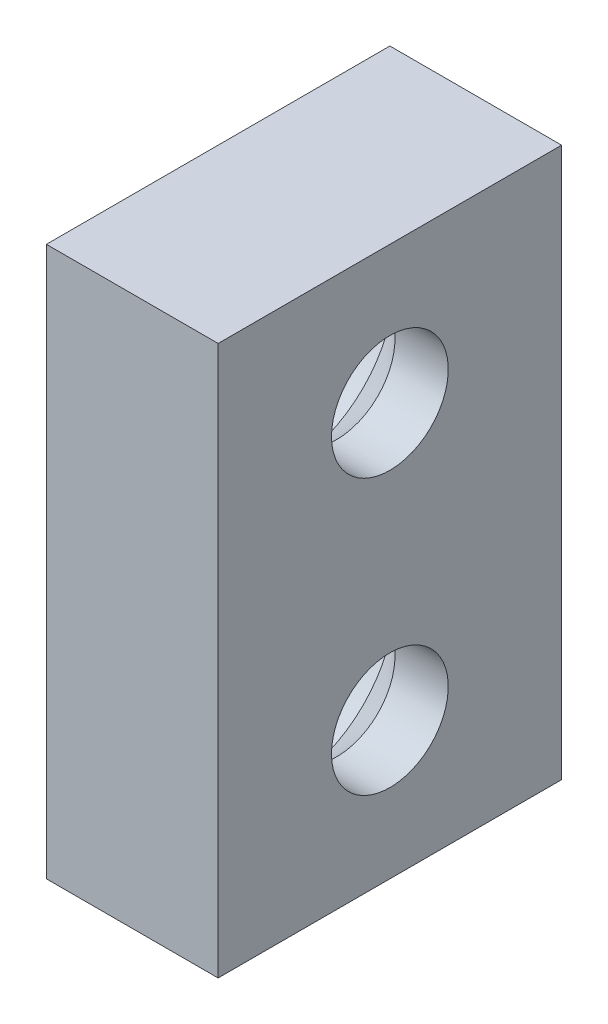
ISO-10303-21;
HEADER;
FILE_DESCRIPTION(('STEP AP214'),'2;1');
FILE_NAME('part.step','',(''),(''),'','','');
FILE_SCHEMA(('AUTOMOTIVE_DESIGN { 1 0 10303 214 1 1 1 1 }'));
ENDSEC;
DATA;
#1=APPLICATION_CONTEXT('core data for automotive mechanical design processes');
#2=APPLICATION_PROTOCOL_DEFINITION('international standard','automotive_design',2000,#1);
#3=PRODUCT_CONTEXT('',#1,'mechanical');
#4=PRODUCT('Part','Part','',(#3));
#5=PRODUCT_RELATED_PRODUCT_CATEGORY('part','',(#4));
#6=PRODUCT_DEFINITION_FORMATION('','',#4);
#7=PRODUCT_DEFINITION_CONTEXT('part definition',#1,'design');
#8=PRODUCT_DEFINITION('design','',#6,#7);
#9=PRODUCT_DEFINITION_SHAPE('','',#8);
#10=(LENGTH_UNIT() NAMED_UNIT(*) SI_UNIT(.MILLI.,.METRE.));
#11=(NAMED_UNIT(*) PLANE_ANGLE_UNIT() SI_UNIT($,.RADIAN.));
#12=(NAMED_UNIT(*) SI_UNIT($,.STERADIAN.) SOLID_ANGLE_UNIT());
#13=UNCERTAINTY_MEASURE_WITH_UNIT(LENGTH_MEASURE(1.E-05),#10,'distance_accuracy_value','');
#14=(GEOMETRIC_REPRESENTATION_CONTEXT(3) GLOBAL_UNCERTAINTY_ASSIGNED_CONTEXT((#13)) GLOBAL_UNIT_ASSIGNED_CONTEXT((#10,
#11,#12)) REPRESENTATION_CONTEXT('',''));
#15=CARTESIAN_POINT('',(0.,0.,0.));
#16=DIRECTION('',(0.,0.,1.));
#17=DIRECTION('',(1.,0.,0.));
#18=AXIS2_PLACEMENT_3D('',#15,#16,#17);
#19=CARTESIAN_POINT('',(2.0023,4.,5.));
#20=DIRECTION('',(-1.,0.,0.));
#21=DIRECTION('',(0.,0.,1.));
#22=AXIS2_PLACEMENT_3D('',#19,#20,#21);
#23=CYLINDRICAL_SURFACE('',#22,3.25);
#24=CARTESIAN_POINT('',(2.0023,4.,5.));
#25=DIRECTION('',(-1.,0.,0.));
#26=DIRECTION('',(0.,0.,1.));
#27=AXIS2_PLACEMENT_3D('',#24,#25,#26);
#28=CIRCLE('',#27,3.25);
#29=CARTESIAN_POINT('',(2.0023,4.,8.25));
#30=VERTEX_POINT('',#29);
#31=EDGE_CURVE('E19',#30,#30,#28,.T.);
#32=ORIENTED_EDGE('',*,*,#31,.F.);
#33=EDGE_LOOP('',(#32));
#34=FACE_BOUND('',#33,.T.);
#35=CARTESIAN_POINT('',(0.00229999999999111,4.,5.));
#36=DIRECTION('',(-1.,0.,0.));
#37=DIRECTION('',(0.,0.,1.));
#38=AXIS2_PLACEMENT_3D('',#35,#36,#37);
#39=CIRCLE('',#38,3.25);
#40=CARTESIAN_POINT('',(0.00229999999999111,4.,8.25));
#41=VERTEX_POINT('',#40);
#42=EDGE_CURVE('E94',#41,#41,#39,.F.);
#43=ORIENTED_EDGE('',*,*,#42,.F.);
#44=EDGE_LOOP('',(#43));
#45=FACE_BOUND('',#44,.T.);
#46=ADVANCED_FACE('F16',(#34,#45),#23,.F.);
#47=CARTESIAN_POINT('',(2.0023,12.,5.));
#48=DIRECTION('',(-1.,0.,0.));
#49=DIRECTION('',(0.,0.,1.));
#50=AXIS2_PLACEMENT_3D('',#47,#48,#49);
#51=CYLINDRICAL_SURFACE('',#50,3.25);
#52=CARTESIAN_POINT('',(2.0023,12.,5.));
#53=DIRECTION('',(-1.,0.,0.));
#54=DIRECTION('',(0.,0.,1.));
#55=AXIS2_PLACEMENT_3D('',#52,#53,#54);
#56=CIRCLE('',#55,3.25);
#57=CARTESIAN_POINT('',(2.0023,12.,8.25));
#58=VERTEX_POINT('',#57);
#59=EDGE_CURVE('E96',#58,#58,#56,.T.);
#60=ORIENTED_EDGE('',*,*,#59,.F.);
#61=EDGE_LOOP('',(#60));
#62=FACE_BOUND('',#61,.T.);
#63=CARTESIAN_POINT('',(0.00229999999999111,12.,5.));
#64=DIRECTION('',(-1.,0.,0.));
#65=DIRECTION('',(0.,0.,1.));
#66=AXIS2_PLACEMENT_3D('',#63,#64,#65);
#67=CIRCLE('',#66,3.25);
#68=CARTESIAN_POINT('',(0.00229999999999111,12.,8.25));
#69=VERTEX_POINT('',#68);
#70=EDGE_CURVE('E91',#69,#69,#67,.F.);
#71=ORIENTED_EDGE('',*,*,#70,.F.);
#72=EDGE_LOOP('',(#71));
#73=FACE_BOUND('',#72,.T.);
#74=ADVANCED_FACE('F107',(#62,#73),#51,.F.);
#75=CARTESIAN_POINT('',(2.0023,4.,5.));
#76=DIRECTION('',(-1.,0.,0.));
#77=DIRECTION('',(0.,0.,1.));
#78=AXIS2_PLACEMENT_3D('',#75,#76,#77);
#79=PLANE('',#78);
#80=CARTESIAN_POINT('',(2.00230000003421,4.,5.));
#81=DIRECTION('',(-1.,0.,0.));
#82=DIRECTION('',(0.,0.,1.));
#83=AXIS2_PLACEMENT_3D('',#80,#81,#82);
#84=CIRCLE('',#83,3.15000000000509);
#85=CARTESIAN_POINT('',(2.00230000003421,4.,8.15000000000509));
#86=VERTEX_POINT('',#85);
#87=EDGE_CURVE('E88',#86,#86,#84,.F.);
#88=ORIENTED_EDGE('',*,*,#87,.T.);
#89=EDGE_LOOP('',(#88));
#90=FACE_BOUND('',#89,.T.);
#91=ORIENTED_EDGE('',*,*,#31,.T.);
#92=EDGE_LOOP('',(#91));
#93=FACE_BOUND('',#92,.T.);
#94=ADVANCED_FACE('F103',(#90,#93),#79,.T.);
#95=CARTESIAN_POINT('',(2.0023,12.,5.));
#96=DIRECTION('',(-1.,0.,0.));
#97=DIRECTION('',(0.,0.,1.));
#98=AXIS2_PLACEMENT_3D('',#95,#96,#97);
#99=PLANE('',#98);
#100=CARTESIAN_POINT('',(2.00230000001557,12.,5.));
#101=DIRECTION('',(-1.,0.,0.));
#102=DIRECTION('',(0.,0.,1.));
#103=AXIS2_PLACEMENT_3D('',#100,#101,#102);
#104=CIRCLE('',#103,3.14999999994825);
#105=CARTESIAN_POINT('',(2.00230000001557,12.,8.14999999994825));
#106=VERTEX_POINT('',#105);
#107=EDGE_CURVE('E73',#106,#106,#104,.F.);
#108=ORIENTED_EDGE('',*,*,#107,.T.);
#109=EDGE_LOOP('',(#108));
#110=FACE_BOUND('',#109,.T.);
#111=ORIENTED_EDGE('',*,*,#59,.T.);
#112=EDGE_LOOP('',(#111));
#113=FACE_BOUND('',#112,.T.);
#114=ADVANCED_FACE('F112',(#110,#113),#99,.T.);
#115=CARTESIAN_POINT('',(0.002299999999991,0.,0.));
#116=DIRECTION('',(-1.,0.,0.));
#117=DIRECTION('',(0.,0.,1.));
#118=AXIS2_PLACEMENT_3D('',#115,#116,#117);
#119=PLANE('',#118);
#120=ORIENTED_EDGE('',*,*,#70,.T.);
#121=EDGE_LOOP('',(#120));
#122=FACE_BOUND('',#121,.T.);
#123=ORIENTED_EDGE('',*,*,#42,.T.);
#124=EDGE_LOOP('',(#123));
#125=FACE_BOUND('',#124,.T.);
#126=DIRECTION('',(0.,1.,0.));
#127=VECTOR('',#126,1.);
#128=CARTESIAN_POINT('',(0.00229999999999068,0.,0.));
#129=LINE('',#128,#127);
#130=CARTESIAN_POINT('',(0.00229999999999076,16.,0.));
#131=VERTEX_POINT('',#130);
#132=CARTESIAN_POINT('',(0.00229999999999084,0.,0.));
#133=VERTEX_POINT('',#132);
#134=EDGE_CURVE('E79',#131,#133,#129,.F.);
#135=ORIENTED_EDGE('',*,*,#134,.T.);
#136=DIRECTION('',(0.,0.,1.));
#137=VECTOR('',#136,1.);
#138=CARTESIAN_POINT('',(0.00229999999999068,0.,0.));
#139=LINE('',#138,#137);
#140=CARTESIAN_POINT('',(0.00229999999999084,0.,10.));
#141=VERTEX_POINT('',#140);
#142=EDGE_CURVE('E69',#133,#141,#139,.T.);
#143=ORIENTED_EDGE('',*,*,#142,.T.);
#144=DIRECTION('',(0.,1.,0.));
#145=VECTOR('',#144,1.);
#146=CARTESIAN_POINT('',(0.00229999999999068,0.,10.));
#147=LINE('',#146,#145);
#148=CARTESIAN_POINT('',(0.00229999999999084,16.,10.));
#149=VERTEX_POINT('',#148);
#150=EDGE_CURVE('E65',#149,#141,#147,.F.);
#151=ORIENTED_EDGE('',*,*,#150,.F.);
#152=DIRECTION('',(0.,0.,1.));
#153=VECTOR('',#152,1.);
#154=CARTESIAN_POINT('',(0.00229999999999068,16.,0.));
#155=LINE('',#154,#153);
#156=EDGE_CURVE('E55',#131,#149,#155,.T.);
#157=ORIENTED_EDGE('',*,*,#156,.F.);
#158=EDGE_LOOP('',(#135,#143,#151,#157));
#159=FACE_BOUND('',#158,.T.);
#160=ADVANCED_FACE('F68',(#122,#125,#159),#119,.T.);
#161=CARTESIAN_POINT('',(2.00230000007195,4.,5.));
#162=DIRECTION('',(-1.,0.,0.));
#163=DIRECTION('',(0.,0.,1.));
#164=AXIS2_PLACEMENT_3D('',#161,#162,#163);
#165=CONICAL_SURFACE('',#164,3.14999999996735,0.785398163397448);
#166=CARTESIAN_POINT('',(3.4523,4.,5.));
#167=DIRECTION('',(-1.,0.,0.));
#168=DIRECTION('',(0.,0.,1.));
#169=AXIS2_PLACEMENT_3D('',#166,#167,#168);
#170=CIRCLE('',#169,1.7);
#171=CARTESIAN_POINT('',(3.4523,4.,6.7));
#172=VERTEX_POINT('',#171);
#173=EDGE_CURVE('E163',#172,#172,#170,.F.);
#174=ORIENTED_EDGE('',*,*,#173,.T.);
#175=EDGE_LOOP('',(#174));
#176=FACE_BOUND('',#175,.T.);
#177=ORIENTED_EDGE('',*,*,#87,.F.);
#178=EDGE_LOOP('',(#177));
#179=FACE_BOUND('',#178,.T.);
#180=ADVANCED_FACE('F111',(#176,#179),#165,.F.);
#181=CARTESIAN_POINT('',(2.00230000007195,12.,5.));
#182=DIRECTION('',(-1.,0.,0.));
#183=DIRECTION('',(0.,0.,1.));
#184=AXIS2_PLACEMENT_3D('',#181,#182,#183);
#185=CONICAL_SURFACE('',#184,3.14999999989186,0.785398163397448);
#186=CARTESIAN_POINT('',(3.4523,12.,5.));
#187=DIRECTION('',(-1.,0.,0.));
#188=DIRECTION('',(0.,0.,1.));
#189=AXIS2_PLACEMENT_3D('',#186,#187,#188);
#190=CIRCLE('',#189,1.7);
#191=CARTESIAN_POINT('',(3.4523,12.,6.7));
#192=VERTEX_POINT('',#191);
#193=EDGE_CURVE('E160',#192,#192,#190,.F.);
#194=ORIENTED_EDGE('',*,*,#193,.T.);
#195=EDGE_LOOP('',(#194));
#196=FACE_BOUND('',#195,.T.);
#197=ORIENTED_EDGE('',*,*,#107,.F.);
#198=EDGE_LOOP('',(#197));
#199=FACE_BOUND('',#198,.T.);
#200=ADVANCED_FACE('F120',(#196,#199),#185,.F.);
#201=CARTESIAN_POINT('',(5.0023,0.,10.));
#202=DIRECTION('',(0.,0.,1.));
#203=DIRECTION('',(1.,0.,0.));
#204=AXIS2_PLACEMENT_3D('',#201,#202,#203);
#205=PLANE('',#204);
#206=DIRECTION('',(1.,0.,0.));
#207=VECTOR('',#206,1.);
#208=CARTESIAN_POINT('',(5.0023,0.,10.));
#209=LINE('',#208,#207);
#210=CARTESIAN_POINT('',(5.0023,0.,10.));
#211=VERTEX_POINT('',#210);
#212=EDGE_CURVE('E172',#141,#211,#209,.T.);
#213=ORIENTED_EDGE('',*,*,#212,.T.);
#214=DIRECTION('',(0.,1.,0.));
#215=VECTOR('',#214,1.);
#216=CARTESIAN_POINT('',(5.0023,0.,10.));
#217=LINE('',#216,#215);
#218=CARTESIAN_POINT('',(5.0023,16.,10.));
#219=VERTEX_POINT('',#218);
#220=EDGE_CURVE('E77',#211,#219,#217,.T.);
#221=ORIENTED_EDGE('',*,*,#220,.T.);
#222=DIRECTION('',(1.,0.,0.));
#223=VECTOR('',#222,1.);
#224=CARTESIAN_POINT('',(5.0023,16.,10.));
#225=LINE('',#224,#223);
#226=EDGE_CURVE('E62',#149,#219,#225,.T.);
#227=ORIENTED_EDGE('',*,*,#226,.F.);
#228=ORIENTED_EDGE('',*,*,#150,.T.);
#229=EDGE_LOOP('',(#213,#221,#227,#228));
#230=FACE_BOUND('',#229,.T.);
#231=ADVANCED_FACE('F76',(#230),#205,.T.);
#232=CARTESIAN_POINT('',(5.0023,16.,0.));
#233=DIRECTION('',(0.,1.,0.));
#234=DIRECTION('',(0.,0.,1.));
#235=AXIS2_PLACEMENT_3D('',#232,#233,#234);
#236=PLANE('',#235);
#237=DIRECTION('',(0.,0.,1.));
#238=VECTOR('',#237,1.);
#239=CARTESIAN_POINT('',(5.0023,16.,0.));
#240=LINE('',#239,#238);
#241=CARTESIAN_POINT('',(5.0023,16.,0.));
#242=VERTEX_POINT('',#241);
#243=EDGE_CURVE('E165',#219,#242,#240,.F.);
#244=ORIENTED_EDGE('',*,*,#243,.T.);
#245=DIRECTION('',(1.,0.,0.));
#246=VECTOR('',#245,1.);
#247=CARTESIAN_POINT('',(5.0023,16.,0.));
#248=LINE('',#247,#246);
#249=EDGE_CURVE('E64',#242,#131,#248,.F.);
#250=ORIENTED_EDGE('',*,*,#249,.T.);
#251=ORIENTED_EDGE('',*,*,#156,.T.);
#252=ORIENTED_EDGE('',*,*,#226,.T.);
#253=EDGE_LOOP('',(#244,#250,#251,#252));
#254=FACE_BOUND('',#253,.T.);
#255=ADVANCED_FACE('F60',(#254),#236,.T.);
#256=CARTESIAN_POINT('',(5.0023,0.,0.));
#257=DIRECTION('',(0.,0.,1.));
#258=DIRECTION('',(1.,0.,0.));
#259=AXIS2_PLACEMENT_3D('',#256,#257,#258);
#260=PLANE('',#259);
#261=DIRECTION('',(1.,0.,0.));
#262=VECTOR('',#261,1.);
#263=CARTESIAN_POINT('',(5.0023,0.,0.));
#264=LINE('',#263,#262);
#265=CARTESIAN_POINT('',(5.0023,0.,0.));
#266=VERTEX_POINT('',#265);
#267=EDGE_CURVE('E34',#266,#133,#264,.F.);
#268=ORIENTED_EDGE('',*,*,#267,.T.);
#269=ORIENTED_EDGE('',*,*,#134,.F.);
#270=ORIENTED_EDGE('',*,*,#249,.F.);
#271=DIRECTION('',(0.,1.,0.));
#272=VECTOR('',#271,1.);
#273=CARTESIAN_POINT('',(5.0023,0.,0.));
#274=LINE('',#273,#272);
#275=EDGE_CURVE('E176',#242,#266,#274,.F.);
#276=ORIENTED_EDGE('',*,*,#275,.T.);
#277=EDGE_LOOP('',(#268,#269,#270,#276));
#278=FACE_BOUND('',#277,.T.);
#279=ADVANCED_FACE('F145',(#278),#260,.F.);
#280=CARTESIAN_POINT('',(5.0023,0.,0.));
#281=DIRECTION('',(0.,1.,0.));
#282=DIRECTION('',(0.,0.,1.));
#283=AXIS2_PLACEMENT_3D('',#280,#281,#282);
#284=PLANE('',#283);
#285=DIRECTION('',(0.,0.,1.));
#286=VECTOR('',#285,1.);
#287=CARTESIAN_POINT('',(5.0023,0.,0.));
#288=LINE('',#287,#286);
#289=EDGE_CURVE('E85',#266,#211,#288,.T.);
#290=ORIENTED_EDGE('',*,*,#289,.T.);
#291=ORIENTED_EDGE('',*,*,#212,.F.);
#292=ORIENTED_EDGE('',*,*,#142,.F.);
#293=ORIENTED_EDGE('',*,*,#267,.F.);
#294=EDGE_LOOP('',(#290,#291,#292,#293));
#295=FACE_BOUND('',#294,.T.);
#296=ADVANCED_FACE('F141',(#295),#284,.F.);
#297=CARTESIAN_POINT('',(5.0023,4.,5.));
#298=DIRECTION('',(-1.,0.,0.));
#299=DIRECTION('',(0.,0.,1.));
#300=AXIS2_PLACEMENT_3D('',#297,#298,#299);
#301=CYLINDRICAL_SURFACE('',#300,1.7);
#302=CARTESIAN_POINT('',(5.0023,4.,5.));
#303=DIRECTION('',(-1.,0.,0.));
#304=DIRECTION('',(0.,0.,1.));
#305=AXIS2_PLACEMENT_3D('',#302,#303,#304);
#306=CIRCLE('',#305,1.7);
#307=CARTESIAN_POINT('',(5.0023,4.,6.7));
#308=VERTEX_POINT('',#307);
#309=EDGE_CURVE('E25',#308,#308,#306,.F.);
#310=ORIENTED_EDGE('',*,*,#309,.T.);
#311=EDGE_LOOP('',(#310));
#312=FACE_BOUND('',#311,.T.);
#313=ORIENTED_EDGE('',*,*,#173,.F.);
#314=EDGE_LOOP('',(#313));
#315=FACE_BOUND('',#314,.T.);
#316=ADVANCED_FACE('F133',(#312,#315),#301,.F.);
#317=CARTESIAN_POINT('',(5.0023,12.,5.));
#318=DIRECTION('',(-1.,0.,0.));
#319=DIRECTION('',(0.,0.,1.));
#320=AXIS2_PLACEMENT_3D('',#317,#318,#319);
#321=CYLINDRICAL_SURFACE('',#320,1.7);
#322=CARTESIAN_POINT('',(5.0023,12.,5.));
#323=DIRECTION('',(-1.,0.,0.));
#324=DIRECTION('',(0.,0.,1.));
#325=AXIS2_PLACEMENT_3D('',#322,#323,#324);
#326=CIRCLE('',#325,1.7);
#327=CARTESIAN_POINT('',(5.0023,12.,6.7));
#328=VERTEX_POINT('',#327);
#329=EDGE_CURVE('E11',#328,#328,#326,.F.);
#330=ORIENTED_EDGE('',*,*,#329,.T.);
#331=EDGE_LOOP('',(#330));
#332=FACE_BOUND('',#331,.T.);
#333=ORIENTED_EDGE('',*,*,#193,.F.);
#334=EDGE_LOOP('',(#333));
#335=FACE_BOUND('',#334,.T.);
#336=ADVANCED_FACE('F127',(#332,#335),#321,.F.);
#337=CARTESIAN_POINT('',(5.0023,0.,0.));
#338=DIRECTION('',(-1.,0.,0.));
#339=DIRECTION('',(0.,0.,1.));
#340=AXIS2_PLACEMENT_3D('',#337,#338,#339);
#341=PLANE('',#340);
#342=ORIENTED_EDGE('',*,*,#329,.F.);
#343=EDGE_LOOP('',(#342));
#344=FACE_BOUND('',#343,.T.);
#345=ORIENTED_EDGE('',*,*,#309,.F.);
#346=EDGE_LOOP('',(#345));
#347=FACE_BOUND('',#346,.T.);
#348=ORIENTED_EDGE('',*,*,#275,.F.);
#349=ORIENTED_EDGE('',*,*,#243,.F.);
#350=ORIENTED_EDGE('',*,*,#220,.F.);
#351=ORIENTED_EDGE('',*,*,#289,.F.);
#352=EDGE_LOOP('',(#348,#349,#350,#351));
#353=FACE_BOUND('',#352,.T.);
#354=ADVANCED_FACE('F125',(#344,#347,#353),#341,.F.);
#355=CLOSED_SHELL('',(#46,#74,#94,#114,#160,#180,#200,#231,#255,#279,#296,#316,#336,#354));
#356=MANIFOLD_SOLID_BREP('B1',#355);
#357=ADVANCED_BREP_SHAPE_REPRESENTATION('',(#18,#356),#14);
#358=SHAPE_DEFINITION_REPRESENTATION(#9,#357);
ENDSEC;
END-ISO-10303-21;
